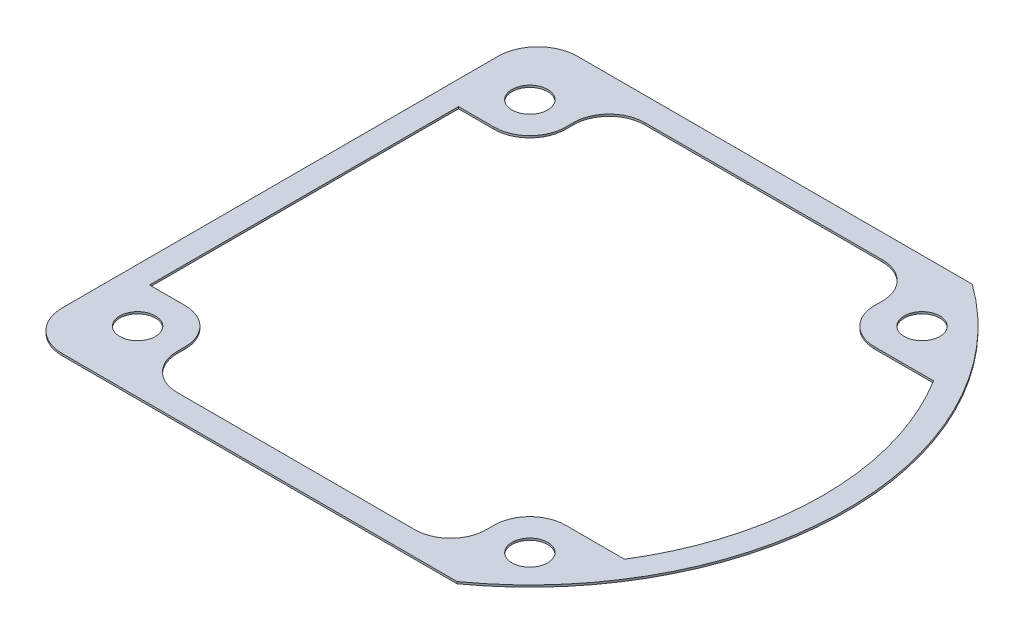
ISO-10303-21;
HEADER;
FILE_DESCRIPTION(('STEP AP214'),'2;1');
FILE_NAME('part.step','',(''),(''),'','','');
FILE_SCHEMA(('AUTOMOTIVE_DESIGN { 1 0 10303 214 1 1 1 1 }'));
ENDSEC;
DATA;
#1=APPLICATION_CONTEXT('core data for automotive mechanical design processes');
#2=APPLICATION_PROTOCOL_DEFINITION('international standard','automotive_design',2000,#1);
#3=PRODUCT_CONTEXT('',#1,'mechanical');
#4=PRODUCT('Part','Part','',(#3));
#5=PRODUCT_RELATED_PRODUCT_CATEGORY('part','',(#4));
#6=PRODUCT_DEFINITION_FORMATION('','',#4);
#7=PRODUCT_DEFINITION_CONTEXT('part definition',#1,'design');
#8=PRODUCT_DEFINITION('design','',#6,#7);
#9=PRODUCT_DEFINITION_SHAPE('','',#8);
#10=(LENGTH_UNIT() NAMED_UNIT(*) SI_UNIT(.MILLI.,.METRE.));
#11=(NAMED_UNIT(*) PLANE_ANGLE_UNIT() SI_UNIT($,.RADIAN.));
#12=(NAMED_UNIT(*) SI_UNIT($,.STERADIAN.) SOLID_ANGLE_UNIT());
#13=UNCERTAINTY_MEASURE_WITH_UNIT(LENGTH_MEASURE(1.E-05),#10,'distance_accuracy_value','');
#14=(GEOMETRIC_REPRESENTATION_CONTEXT(3) GLOBAL_UNCERTAINTY_ASSIGNED_CONTEXT((#13)) GLOBAL_UNIT_ASSIGNED_CONTEXT((#10,
#11,#12)) REPRESENTATION_CONTEXT('',''));
#15=CARTESIAN_POINT('',(0.,0.,0.));
#16=DIRECTION('',(0.,0.,1.));
#17=DIRECTION('',(1.,0.,0.));
#18=AXIS2_PLACEMENT_3D('',#15,#16,#17);
#19=CARTESIAN_POINT('',(-63.,0.5,-65.));
#20=DIRECTION('',(1.,0.,0.));
#21=DIRECTION('',(0.,0.,-1.));
#22=AXIS2_PLACEMENT_3D('',#19,#20,#21);
#23=PLANE('',#22);
#24=DIRECTION('',(0.,0.,1.));
#25=VECTOR('',#24,1.);
#26=CARTESIAN_POINT('',(-63.,0.5,-65.));
#27=LINE('',#26,#25);
#28=CARTESIAN_POINT('',(-63.,0.5,-55.));
#29=VERTEX_POINT('',#28);
#30=CARTESIAN_POINT('',(-63.,0.5,55.));
#31=VERTEX_POINT('',#30);
#32=EDGE_CURVE('E397',#29,#31,#27,.T.);
#33=ORIENTED_EDGE('',*,*,#32,.F.);
#34=DIRECTION('',(0.,-1.,0.));
#35=VECTOR('',#34,1.);
#36=CARTESIAN_POINT('',(-63.,0.5,-55.));
#37=LINE('',#36,#35);
#38=CARTESIAN_POINT('',(-63.,0.,-55.));
#39=VERTEX_POINT('',#38);
#40=EDGE_CURVE('E424',#29,#39,#37,.T.);
#41=ORIENTED_EDGE('',*,*,#40,.T.);
#42=DIRECTION('',(0.,0.,1.));
#43=VECTOR('',#42,1.);
#44=CARTESIAN_POINT('',(-63.,0.,-65.));
#45=LINE('',#44,#43);
#46=CARTESIAN_POINT('',(-63.,0.,55.));
#47=VERTEX_POINT('',#46);
#48=EDGE_CURVE('E394',#39,#47,#45,.T.);
#49=ORIENTED_EDGE('',*,*,#48,.T.);
#50=DIRECTION('',(0.,-1.,0.));
#51=VECTOR('',#50,1.);
#52=CARTESIAN_POINT('',(-63.,0.5,55.));
#53=LINE('',#52,#51);
#54=EDGE_CURVE('E422',#47,#31,#53,.F.);
#55=ORIENTED_EDGE('',*,*,#54,.T.);
#56=EDGE_LOOP('',(#33,#41,#49,#55));
#57=FACE_BOUND('',#56,.T.);
#58=ADVANCED_FACE('F35',(#57),#23,.F.);
#59=CARTESIAN_POINT('',(-63.,0.5,65.));
#60=DIRECTION('',(0.,0.,-1.));
#61=DIRECTION('',(-1.,0.,0.));
#62=AXIS2_PLACEMENT_3D('',#59,#60,#61);
#63=PLANE('',#62);
#64=DIRECTION('',(1.,0.,0.));
#65=VECTOR('',#64,1.);
#66=CARTESIAN_POINT('',(-63.,0.5,65.));
#67=LINE('',#66,#65);
#68=CARTESIAN_POINT('',(-53.,0.5,65.));
#69=VERTEX_POINT('',#68);
#70=CARTESIAN_POINT('',(46.6368952654441,0.5,65.));
#71=VERTEX_POINT('',#70);
#72=EDGE_CURVE('E400',#69,#71,#67,.T.);
#73=ORIENTED_EDGE('',*,*,#72,.F.);
#74=DIRECTION('',(0.,-1.,0.));
#75=VECTOR('',#74,1.);
#76=CARTESIAN_POINT('',(-53.,0.5,65.));
#77=LINE('',#76,#75);
#78=CARTESIAN_POINT('',(-53.,0.,65.));
#79=VERTEX_POINT('',#78);
#80=EDGE_CURVE('E11',#69,#79,#77,.T.);
#81=ORIENTED_EDGE('',*,*,#80,.T.);
#82=DIRECTION('',(1.,0.,0.));
#83=VECTOR('',#82,1.);
#84=CARTESIAN_POINT('',(-63.,0.,65.));
#85=LINE('',#84,#83);
#86=CARTESIAN_POINT('',(46.6368952654441,0.,65.));
#87=VERTEX_POINT('',#86);
#88=EDGE_CURVE('E411',#79,#87,#85,.T.);
#89=ORIENTED_EDGE('',*,*,#88,.T.);
#90=DIRECTION('',(0.,-1.,0.));
#91=VECTOR('',#90,1.);
#92=CARTESIAN_POINT('',(46.6368952654441,0.5,65.));
#93=LINE('',#92,#91);
#94=EDGE_CURVE('E419',#71,#87,#93,.T.);
#95=ORIENTED_EDGE('',*,*,#94,.F.);
#96=EDGE_LOOP('',(#73,#81,#89,#95));
#97=FACE_BOUND('',#96,.T.);
#98=ADVANCED_FACE('F460',(#97),#63,.F.);
#99=CARTESIAN_POINT('',(0.,0.5,0.));
#100=DIRECTION('',(0.,-1.,0.));
#101=DIRECTION('',(0.,0.,-1.));
#102=AXIS2_PLACEMENT_3D('',#99,#100,#101);
#103=CYLINDRICAL_SURFACE('',#102,80.);
#104=CARTESIAN_POINT('',(0.,0.,0.));
#105=DIRECTION('',(0.,1.,0.));
#106=DIRECTION('',(0.,0.,1.));
#107=AXIS2_PLACEMENT_3D('',#104,#105,#106);
#108=CIRCLE('',#107,80.);
#109=CARTESIAN_POINT('',(46.6368952654441,0.,-65.));
#110=VERTEX_POINT('',#109);
#111=EDGE_CURVE('E413',#87,#110,#108,.T.);
#112=ORIENTED_EDGE('',*,*,#111,.T.);
#113=DIRECTION('',(0.,-1.,0.));
#114=VECTOR('',#113,1.);
#115=CARTESIAN_POINT('',(46.6368952654441,0.5,-65.));
#116=LINE('',#115,#114);
#117=CARTESIAN_POINT('',(46.6368952654441,0.5,-65.));
#118=VERTEX_POINT('',#117);
#119=EDGE_CURVE('E408',#118,#110,#116,.T.);
#120=ORIENTED_EDGE('',*,*,#119,.F.);
#121=CARTESIAN_POINT('',(0.,0.5,0.));
#122=DIRECTION('',(0.,1.,0.));
#123=DIRECTION('',(0.,0.,1.));
#124=AXIS2_PLACEMENT_3D('',#121,#122,#123);
#125=CIRCLE('',#124,80.);
#126=EDGE_CURVE('E403',#71,#118,#125,.T.);
#127=ORIENTED_EDGE('',*,*,#126,.F.);
#128=ORIENTED_EDGE('',*,*,#94,.T.);
#129=EDGE_LOOP('',(#112,#120,#127,#128));
#130=FACE_BOUND('',#129,.T.);
#131=ADVANCED_FACE('F455',(#130),#103,.T.);
#132=CARTESIAN_POINT('',(-63.,0.5,-65.));
#133=DIRECTION('',(0.,0.,1.));
#134=DIRECTION('',(1.,0.,0.));
#135=AXIS2_PLACEMENT_3D('',#132,#133,#134);
#136=PLANE('',#135);
#137=DIRECTION('',(-1.,0.,0.));
#138=VECTOR('',#137,1.);
#139=CARTESIAN_POINT('',(-63.,0.,-65.));
#140=LINE('',#139,#138);
#141=CARTESIAN_POINT('',(-53.,0.,-65.));
#142=VERTEX_POINT('',#141);
#143=EDGE_CURVE('E401',#110,#142,#140,.T.);
#144=ORIENTED_EDGE('',*,*,#143,.T.);
#145=DIRECTION('',(0.,-1.,0.));
#146=VECTOR('',#145,1.);
#147=CARTESIAN_POINT('',(-53.,0.5,-65.));
#148=LINE('',#147,#146);
#149=CARTESIAN_POINT('',(-53.,0.5,-65.));
#150=VERTEX_POINT('',#149);
#151=EDGE_CURVE('E431',#142,#150,#148,.F.);
#152=ORIENTED_EDGE('',*,*,#151,.T.);
#153=DIRECTION('',(-1.,0.,0.));
#154=VECTOR('',#153,1.);
#155=CARTESIAN_POINT('',(-63.,0.5,-65.));
#156=LINE('',#155,#154);
#157=EDGE_CURVE('E405',#118,#150,#156,.T.);
#158=ORIENTED_EDGE('',*,*,#157,.F.);
#159=ORIENTED_EDGE('',*,*,#119,.T.);
#160=EDGE_LOOP('',(#144,#152,#158,#159));
#161=FACE_BOUND('',#160,.T.);
#162=ADVANCED_FACE('F451',(#161),#136,.F.);
#163=CARTESIAN_POINT('',(0.,0.5,0.));
#164=DIRECTION('',(0.,1.,0.));
#165=DIRECTION('',(0.,0.,1.));
#166=AXIS2_PLACEMENT_3D('',#163,#164,#165);
#167=PLANE('',#166);
#168=CARTESIAN_POINT('',(47.9974746830591,0.5,-47.9974746830576));
#169=DIRECTION('',(0.,-1.,0.));
#170=DIRECTION('',(0.,0.,-1.));
#171=AXIS2_PLACEMENT_3D('',#168,#169,#170);
#172=CIRCLE('',#171,8.99999999999999);
#173=CARTESIAN_POINT('',(47.9974746830592,0.5,-38.9974746830576));
#174=VERTEX_POINT('',#173);
#175=CARTESIAN_POINT('',(38.9974746830591,0.5,-47.9974746830576));
#176=VERTEX_POINT('',#175);
#177=EDGE_CURVE('E50',#174,#176,#172,.T.);
#178=ORIENTED_EDGE('',*,*,#177,.F.);
#179=DIRECTION('',(-1.,0.,0.));
#180=VECTOR('',#179,1.);
#181=CARTESIAN_POINT('',(47.9974746830592,0.5,-38.9974746830576));
#182=LINE('',#181,#180);
#183=CARTESIAN_POINT('',(62.8903567198047,0.5,-38.9974746830576));
#184=VERTEX_POINT('',#183);
#185=EDGE_CURVE('E227',#184,#174,#182,.T.);
#186=ORIENTED_EDGE('',*,*,#185,.F.);
#187=CARTESIAN_POINT('',(0.,0.5,0.));
#188=DIRECTION('',(0.,1.,0.));
#189=DIRECTION('',(0.,0.,1.));
#190=AXIS2_PLACEMENT_3D('',#187,#188,#189);
#191=CIRCLE('',#190,74.);
#192=CARTESIAN_POINT('',(62.8903567198047,0.5,38.9974746830576));
#193=VERTEX_POINT('',#192);
#194=EDGE_CURVE('E230',#193,#184,#191,.T.);
#195=ORIENTED_EDGE('',*,*,#194,.F.);
#196=DIRECTION('',(1.,0.,0.));
#197=VECTOR('',#196,1.);
#198=CARTESIAN_POINT('',(47.9974746830592,0.5,38.9974746830576));
#199=LINE('',#198,#197);
#200=CARTESIAN_POINT('',(47.9974746830592,0.5,38.9974746830576));
#201=VERTEX_POINT('',#200);
#202=EDGE_CURVE('E330',#201,#193,#199,.T.);
#203=ORIENTED_EDGE('',*,*,#202,.F.);
#204=CARTESIAN_POINT('',(47.9974746830591,0.5,47.9974746830576));
#205=DIRECTION('',(0.,-1.,0.));
#206=DIRECTION('',(0.,0.,1.));
#207=AXIS2_PLACEMENT_3D('',#204,#205,#206);
#208=CIRCLE('',#207,8.99999999999999);
#209=CARTESIAN_POINT('',(38.9974746830591,0.5,47.9974746830576));
#210=VERTEX_POINT('',#209);
#211=EDGE_CURVE('E327',#210,#201,#208,.T.);
#212=ORIENTED_EDGE('',*,*,#211,.F.);
#213=DIRECTION('',(0.,0.,-1.));
#214=VECTOR('',#213,1.);
#215=CARTESIAN_POINT('',(38.9974746830591,0.5,47.9974746830576));
#216=LINE('',#215,#214);
#217=CARTESIAN_POINT('',(38.9974746830591,0.5,49.9999999999999));
#218=VERTEX_POINT('',#217);
#219=EDGE_CURVE('E324',#218,#210,#216,.T.);
#220=ORIENTED_EDGE('',*,*,#219,.F.);
#221=CARTESIAN_POINT('',(29.9974746830591,0.5,50.));
#222=DIRECTION('',(0.,1.,0.));
#223=DIRECTION('',(0.,0.,-1.));
#224=AXIS2_PLACEMENT_3D('',#221,#222,#223);
#225=CIRCLE('',#224,9.);
#226=CARTESIAN_POINT('',(29.9974746830591,0.5,59.));
#227=VERTEX_POINT('',#226);
#228=EDGE_CURVE('E321',#227,#218,#225,.T.);
#229=ORIENTED_EDGE('',*,*,#228,.F.);
#230=DIRECTION('',(1.,0.,0.));
#231=VECTOR('',#230,1.);
#232=CARTESIAN_POINT('',(-29.9974746830591,0.5,59.));
#233=LINE('',#232,#231);
#234=CARTESIAN_POINT('',(-29.9974746830591,0.5,59.));
#235=VERTEX_POINT('',#234);
#236=EDGE_CURVE('E318',#235,#227,#233,.T.);
#237=ORIENTED_EDGE('',*,*,#236,.F.);
#238=CARTESIAN_POINT('',(-29.9974746830591,0.5,50.));
#239=DIRECTION('',(0.,1.,0.));
#240=DIRECTION('',(0.,0.,1.));
#241=AXIS2_PLACEMENT_3D('',#238,#239,#240);
#242=CIRCLE('',#241,9.);
#243=CARTESIAN_POINT('',(-38.9974746830591,0.5,49.9999999999999));
#244=VERTEX_POINT('',#243);
#245=EDGE_CURVE('E315',#244,#235,#242,.T.);
#246=ORIENTED_EDGE('',*,*,#245,.F.);
#247=DIRECTION('',(0.,0.,1.));
#248=VECTOR('',#247,1.);
#249=CARTESIAN_POINT('',(-38.9974746830591,0.5,47.9974746830576));
#250=LINE('',#249,#248);
#251=CARTESIAN_POINT('',(-38.9974746830591,0.5,47.9974746830576));
#252=VERTEX_POINT('',#251);
#253=EDGE_CURVE('E312',#252,#244,#250,.T.);
#254=ORIENTED_EDGE('',*,*,#253,.F.);
#255=CARTESIAN_POINT('',(-47.9974746830591,0.5,47.9974746830576));
#256=DIRECTION('',(0.,-1.,0.));
#257=DIRECTION('',(0.,0.,-1.));
#258=AXIS2_PLACEMENT_3D('',#255,#256,#257);
#259=CIRCLE('',#258,8.99999999999999);
#260=CARTESIAN_POINT('',(-47.9974746830592,0.5,38.9974746830576));
#261=VERTEX_POINT('',#260);
#262=EDGE_CURVE('E309',#261,#252,#259,.T.);
#263=ORIENTED_EDGE('',*,*,#262,.F.);
#264=DIRECTION('',(1.,0.,0.));
#265=VECTOR('',#264,1.);
#266=CARTESIAN_POINT('',(-47.9974746830592,0.5,38.9974746830576));
#267=LINE('',#266,#265);
#268=CARTESIAN_POINT('',(-57.,0.5,38.9974746830576));
#269=VERTEX_POINT('',#268);
#270=EDGE_CURVE('E306',#269,#261,#267,.T.);
#271=ORIENTED_EDGE('',*,*,#270,.F.);
#272=DIRECTION('',(0.,0.,1.));
#273=VECTOR('',#272,1.);
#274=CARTESIAN_POINT('',(-57.,0.5,-38.9974746830576));
#275=LINE('',#274,#273);
#276=CARTESIAN_POINT('',(-57.,0.5,-38.9974746830576));
#277=VERTEX_POINT('',#276);
#278=EDGE_CURVE('E303',#277,#269,#275,.T.);
#279=ORIENTED_EDGE('',*,*,#278,.F.);
#280=DIRECTION('',(-1.,0.,0.));
#281=VECTOR('',#280,1.);
#282=CARTESIAN_POINT('',(-47.9974746830592,0.5,-38.9974746830576));
#283=LINE('',#282,#281);
#284=CARTESIAN_POINT('',(-47.9974746830592,0.5,-38.9974746830576));
#285=VERTEX_POINT('',#284);
#286=EDGE_CURVE('E300',#285,#277,#283,.T.);
#287=ORIENTED_EDGE('',*,*,#286,.F.);
#288=CARTESIAN_POINT('',(-47.9974746830591,0.5,-47.9974746830576));
#289=DIRECTION('',(0.,-1.,0.));
#290=DIRECTION('',(0.,0.,1.));
#291=AXIS2_PLACEMENT_3D('',#288,#289,#290);
#292=CIRCLE('',#291,8.99999999999999);
#293=CARTESIAN_POINT('',(-38.9974746830591,0.5,-47.9974746830576));
#294=VERTEX_POINT('',#293);
#295=EDGE_CURVE('E297',#294,#285,#292,.T.);
#296=ORIENTED_EDGE('',*,*,#295,.F.);
#297=DIRECTION('',(0.,0.,1.));
#298=VECTOR('',#297,1.);
#299=CARTESIAN_POINT('',(-38.9974746830591,0.5,-47.9974746830576));
#300=LINE('',#299,#298);
#301=CARTESIAN_POINT('',(-38.9974746830591,0.5,-49.9999999999999));
#302=VERTEX_POINT('',#301);
#303=EDGE_CURVE('E294',#302,#294,#300,.T.);
#304=ORIENTED_EDGE('',*,*,#303,.F.);
#305=CARTESIAN_POINT('',(-29.9974746830591,0.5,-50.));
#306=DIRECTION('',(0.,1.,0.));
#307=DIRECTION('',(0.,0.,-1.));
#308=AXIS2_PLACEMENT_3D('',#305,#306,#307);
#309=CIRCLE('',#308,9.);
#310=CARTESIAN_POINT('',(-29.9974746830591,0.5,-59.));
#311=VERTEX_POINT('',#310);
#312=EDGE_CURVE('E291',#311,#302,#309,.T.);
#313=ORIENTED_EDGE('',*,*,#312,.F.);
#314=DIRECTION('',(-1.,0.,0.));
#315=VECTOR('',#314,1.);
#316=CARTESIAN_POINT('',(29.9974746830591,0.5,-59.));
#317=LINE('',#316,#315);
#318=CARTESIAN_POINT('',(29.9974746830591,0.5,-59.));
#319=VERTEX_POINT('',#318);
#320=EDGE_CURVE('E288',#319,#311,#317,.T.);
#321=ORIENTED_EDGE('',*,*,#320,.F.);
#322=CARTESIAN_POINT('',(29.9974746830591,0.5,-50.));
#323=DIRECTION('',(0.,1.,0.));
#324=DIRECTION('',(0.,0.,1.));
#325=AXIS2_PLACEMENT_3D('',#322,#323,#324);
#326=CIRCLE('',#325,9.);
#327=CARTESIAN_POINT('',(38.9974746830591,0.5,-49.9999999999999));
#328=VERTEX_POINT('',#327);
#329=EDGE_CURVE('E285',#328,#319,#326,.T.);
#330=ORIENTED_EDGE('',*,*,#329,.F.);
#331=DIRECTION('',(0.,0.,-1.));
#332=VECTOR('',#331,1.);
#333=CARTESIAN_POINT('',(38.9974746830591,0.5,-47.9974746830576));
#334=LINE('',#333,#332);
#335=EDGE_CURVE('E283',#176,#328,#334,.T.);
#336=ORIENTED_EDGE('',*,*,#335,.F.);
#337=EDGE_LOOP('',(#178,#186,#195,#203,#212,#220,#229,#237,#246,#254,#263,#271,#279,#287,#296,
#304,#313,#321,#330,#336));
#338=FACE_BOUND('',#337,.T.);
#339=CARTESIAN_POINT('',(-49.4974746830577,0.5,-49.4974746830589));
#340=DIRECTION('',(0.,1.,0.));
#341=DIRECTION('',(0.,0.,1.));
#342=AXIS2_PLACEMENT_3D('',#339,#340,#341);
#343=CIRCLE('',#342,4.5);
#344=CARTESIAN_POINT('',(-49.4974746830577,0.5,-44.9974746830589));
#345=VERTEX_POINT('',#344);
#346=EDGE_CURVE('E337',#345,#345,#343,.T.);
#347=ORIENTED_EDGE('',*,*,#346,.F.);
#348=EDGE_LOOP('',(#347));
#349=FACE_BOUND('',#348,.T.);
#350=CARTESIAN_POINT('',(49.4974746830591,0.5,-49.4974746830576));
#351=DIRECTION('',(0.,1.,0.));
#352=DIRECTION('',(0.,0.,1.));
#353=AXIS2_PLACEMENT_3D('',#350,#351,#352);
#354=CIRCLE('',#353,4.5);
#355=CARTESIAN_POINT('',(49.4974746830591,0.5,-44.9974746830576));
#356=VERTEX_POINT('',#355);
#357=EDGE_CURVE('E383',#356,#356,#354,.T.);
#358=ORIENTED_EDGE('',*,*,#357,.F.);
#359=EDGE_LOOP('',(#358));
#360=FACE_BOUND('',#359,.T.);
#361=CARTESIAN_POINT('',(49.4974746830581,0.5,49.4974746830586));
#362=DIRECTION('',(0.,1.,0.));
#363=DIRECTION('',(0.,0.,1.));
#364=AXIS2_PLACEMENT_3D('',#361,#362,#363);
#365=CIRCLE('',#364,4.5);
#366=CARTESIAN_POINT('',(49.4974746830581,0.5,53.9974746830586));
#367=VERTEX_POINT('',#366);
#368=EDGE_CURVE('E377',#367,#367,#365,.T.);
#369=ORIENTED_EDGE('',*,*,#368,.F.);
#370=EDGE_LOOP('',(#369));
#371=FACE_BOUND('',#370,.T.);
#372=CARTESIAN_POINT('',(-49.4974746830588,0.5,49.4974746830579));
#373=DIRECTION('',(0.,1.,0.));
#374=DIRECTION('',(0.,0.,1.));
#375=AXIS2_PLACEMENT_3D('',#372,#373,#374);
#376=CIRCLE('',#375,4.5);
#377=CARTESIAN_POINT('',(-49.4974746830588,0.5,53.9974746830579));
#378=VERTEX_POINT('',#377);
#379=EDGE_CURVE('E376',#378,#378,#376,.T.);
#380=ORIENTED_EDGE('',*,*,#379,.F.);
#381=EDGE_LOOP('',(#380));
#382=FACE_BOUND('',#381,.T.);
#383=ORIENTED_EDGE('',*,*,#157,.T.);
#384=CARTESIAN_POINT('',(-53.,0.5,-55.));
#385=DIRECTION('',(0.,1.,0.));
#386=DIRECTION('',(0.,0.,1.));
#387=AXIS2_PLACEMENT_3D('',#384,#385,#386);
#388=CIRCLE('',#387,10.);
#389=EDGE_CURVE('E43',#150,#29,#388,.T.);
#390=ORIENTED_EDGE('',*,*,#389,.T.);
#391=ORIENTED_EDGE('',*,*,#32,.T.);
#392=CARTESIAN_POINT('',(-53.,0.5,55.));
#393=DIRECTION('',(0.,1.,0.));
#394=DIRECTION('',(0.,0.,1.));
#395=AXIS2_PLACEMENT_3D('',#392,#393,#394);
#396=CIRCLE('',#395,10.);
#397=EDGE_CURVE('E433',#31,#69,#396,.T.);
#398=ORIENTED_EDGE('',*,*,#397,.T.);
#399=ORIENTED_EDGE('',*,*,#72,.T.);
#400=ORIENTED_EDGE('',*,*,#126,.T.);
#401=EDGE_LOOP('',(#383,#390,#391,#398,#399,#400));
#402=FACE_BOUND('',#401,.T.);
#403=ADVANCED_FACE('F437',(#338,#349,#360,#371,#382,#402),#167,.T.);
#404=CARTESIAN_POINT('',(0.,0.,0.));
#405=DIRECTION('',(0.,1.,0.));
#406=DIRECTION('',(0.,0.,1.));
#407=AXIS2_PLACEMENT_3D('',#404,#405,#406);
#408=PLANE('',#407);
#409=DIRECTION('',(-1.,0.,0.));
#410=VECTOR('',#409,1.);
#411=CARTESIAN_POINT('',(47.9974746830592,0.,-38.9974746830576));
#412=LINE('',#411,#410);
#413=CARTESIAN_POINT('',(62.8903567198047,0.,-38.9974746830576));
#414=VERTEX_POINT('',#413);
#415=CARTESIAN_POINT('',(47.9974746830592,0.,-38.9974746830576));
#416=VERTEX_POINT('',#415);
#417=EDGE_CURVE('E216',#414,#416,#412,.T.);
#418=ORIENTED_EDGE('',*,*,#417,.T.);
#419=CARTESIAN_POINT('',(47.9974746830591,0.,-47.9974746830576));
#420=DIRECTION('',(0.,-1.,0.));
#421=DIRECTION('',(0.,0.,-1.));
#422=AXIS2_PLACEMENT_3D('',#419,#420,#421);
#423=CIRCLE('',#422,8.99999999999999);
#424=CARTESIAN_POINT('',(38.9974746830591,0.,-47.9974746830576));
#425=VERTEX_POINT('',#424);
#426=EDGE_CURVE('E210',#416,#425,#423,.T.);
#427=ORIENTED_EDGE('',*,*,#426,.T.);
#428=DIRECTION('',(0.,0.,-1.));
#429=VECTOR('',#428,1.);
#430=CARTESIAN_POINT('',(38.9974746830591,0.,-47.9974746830576));
#431=LINE('',#430,#429);
#432=CARTESIAN_POINT('',(38.9974746830591,0.,-49.9999999999999));
#433=VERTEX_POINT('',#432);
#434=EDGE_CURVE('E219',#425,#433,#431,.T.);
#435=ORIENTED_EDGE('',*,*,#434,.T.);
#436=CARTESIAN_POINT('',(29.9974746830591,0.,-50.));
#437=DIRECTION('',(0.,1.,0.));
#438=DIRECTION('',(0.,0.,1.));
#439=AXIS2_PLACEMENT_3D('',#436,#437,#438);
#440=CIRCLE('',#439,9.);
#441=CARTESIAN_POINT('',(29.9974746830591,0.,-59.));
#442=VERTEX_POINT('',#441);
#443=EDGE_CURVE('E58',#433,#442,#440,.T.);
#444=ORIENTED_EDGE('',*,*,#443,.T.);
#445=DIRECTION('',(-1.,0.,0.));
#446=VECTOR('',#445,1.);
#447=CARTESIAN_POINT('',(29.9974746830591,0.,-59.));
#448=LINE('',#447,#446);
#449=CARTESIAN_POINT('',(-29.9974746830591,0.,-59.));
#450=VERTEX_POINT('',#449);
#451=EDGE_CURVE('E234',#442,#450,#448,.T.);
#452=ORIENTED_EDGE('',*,*,#451,.T.);
#453=CARTESIAN_POINT('',(-29.9974746830591,0.,-50.));
#454=DIRECTION('',(0.,1.,0.));
#455=DIRECTION('',(0.,0.,-1.));
#456=AXIS2_PLACEMENT_3D('',#453,#454,#455);
#457=CIRCLE('',#456,9.);
#458=CARTESIAN_POINT('',(-38.9974746830591,0.,-49.9999999999999));
#459=VERTEX_POINT('',#458);
#460=EDGE_CURVE('E237',#450,#459,#457,.T.);
#461=ORIENTED_EDGE('',*,*,#460,.T.);
#462=DIRECTION('',(0.,0.,1.));
#463=VECTOR('',#462,1.);
#464=CARTESIAN_POINT('',(-38.9974746830591,0.,-47.9974746830576));
#465=LINE('',#464,#463);
#466=CARTESIAN_POINT('',(-38.9974746830591,0.,-47.9974746830576));
#467=VERTEX_POINT('',#466);
#468=EDGE_CURVE('E240',#459,#467,#465,.T.);
#469=ORIENTED_EDGE('',*,*,#468,.T.);
#470=CARTESIAN_POINT('',(-47.9974746830591,0.,-47.9974746830576));
#471=DIRECTION('',(0.,-1.,0.));
#472=DIRECTION('',(0.,0.,1.));
#473=AXIS2_PLACEMENT_3D('',#470,#471,#472);
#474=CIRCLE('',#473,8.99999999999999);
#475=CARTESIAN_POINT('',(-47.9974746830592,0.,-38.9974746830576));
#476=VERTEX_POINT('',#475);
#477=EDGE_CURVE('E243',#467,#476,#474,.T.);
#478=ORIENTED_EDGE('',*,*,#477,.T.);
#479=DIRECTION('',(-1.,0.,0.));
#480=VECTOR('',#479,1.);
#481=CARTESIAN_POINT('',(-47.9974746830592,0.,-38.9974746830576));
#482=LINE('',#481,#480);
#483=CARTESIAN_POINT('',(-57.,0.,-38.9974746830576));
#484=VERTEX_POINT('',#483);
#485=EDGE_CURVE('E246',#476,#484,#482,.T.);
#486=ORIENTED_EDGE('',*,*,#485,.T.);
#487=DIRECTION('',(0.,0.,1.));
#488=VECTOR('',#487,1.);
#489=CARTESIAN_POINT('',(-57.,0.,-38.9974746830576));
#490=LINE('',#489,#488);
#491=CARTESIAN_POINT('',(-57.,0.,38.9974746830576));
#492=VERTEX_POINT('',#491);
#493=EDGE_CURVE('E249',#484,#492,#490,.T.);
#494=ORIENTED_EDGE('',*,*,#493,.T.);
#495=DIRECTION('',(1.,0.,0.));
#496=VECTOR('',#495,1.);
#497=CARTESIAN_POINT('',(-47.9974746830592,0.,38.9974746830576));
#498=LINE('',#497,#496);
#499=CARTESIAN_POINT('',(-47.9974746830592,0.,38.9974746830576));
#500=VERTEX_POINT('',#499);
#501=EDGE_CURVE('E252',#492,#500,#498,.T.);
#502=ORIENTED_EDGE('',*,*,#501,.T.);
#503=CARTESIAN_POINT('',(-47.9974746830591,0.,47.9974746830576));
#504=DIRECTION('',(0.,-1.,0.));
#505=DIRECTION('',(0.,0.,-1.));
#506=AXIS2_PLACEMENT_3D('',#503,#504,#505);
#507=CIRCLE('',#506,8.99999999999999);
#508=CARTESIAN_POINT('',(-38.9974746830591,0.,47.9974746830576));
#509=VERTEX_POINT('',#508);
#510=EDGE_CURVE('E255',#500,#509,#507,.T.);
#511=ORIENTED_EDGE('',*,*,#510,.T.);
#512=DIRECTION('',(0.,0.,1.));
#513=VECTOR('',#512,1.);
#514=CARTESIAN_POINT('',(-38.9974746830591,0.,47.9974746830576));
#515=LINE('',#514,#513);
#516=CARTESIAN_POINT('',(-38.9974746830591,0.,49.9999999999999));
#517=VERTEX_POINT('',#516);
#518=EDGE_CURVE('E258',#509,#517,#515,.T.);
#519=ORIENTED_EDGE('',*,*,#518,.T.);
#520=CARTESIAN_POINT('',(-29.9974746830591,0.,50.));
#521=DIRECTION('',(0.,1.,0.));
#522=DIRECTION('',(0.,0.,1.));
#523=AXIS2_PLACEMENT_3D('',#520,#521,#522);
#524=CIRCLE('',#523,9.);
#525=CARTESIAN_POINT('',(-29.9974746830591,0.,59.));
#526=VERTEX_POINT('',#525);
#527=EDGE_CURVE('E261',#517,#526,#524,.T.);
#528=ORIENTED_EDGE('',*,*,#527,.T.);
#529=DIRECTION('',(1.,0.,0.));
#530=VECTOR('',#529,1.);
#531=CARTESIAN_POINT('',(-29.9974746830591,0.,59.));
#532=LINE('',#531,#530);
#533=CARTESIAN_POINT('',(29.9974746830591,0.,59.));
#534=VERTEX_POINT('',#533);
#535=EDGE_CURVE('E264',#526,#534,#532,.T.);
#536=ORIENTED_EDGE('',*,*,#535,.T.);
#537=CARTESIAN_POINT('',(29.9974746830591,0.,50.));
#538=DIRECTION('',(0.,1.,0.));
#539=DIRECTION('',(0.,0.,-1.));
#540=AXIS2_PLACEMENT_3D('',#537,#538,#539);
#541=CIRCLE('',#540,9.);
#542=CARTESIAN_POINT('',(38.9974746830591,0.,49.9999999999999));
#543=VERTEX_POINT('',#542);
#544=EDGE_CURVE('E267',#534,#543,#541,.T.);
#545=ORIENTED_EDGE('',*,*,#544,.T.);
#546=DIRECTION('',(0.,0.,-1.));
#547=VECTOR('',#546,1.);
#548=CARTESIAN_POINT('',(38.9974746830591,0.,47.9974746830576));
#549=LINE('',#548,#547);
#550=CARTESIAN_POINT('',(38.9974746830591,0.,47.9974746830576));
#551=VERTEX_POINT('',#550);
#552=EDGE_CURVE('E270',#543,#551,#549,.T.);
#553=ORIENTED_EDGE('',*,*,#552,.T.);
#554=CARTESIAN_POINT('',(47.9974746830591,0.,47.9974746830576));
#555=DIRECTION('',(0.,-1.,0.));
#556=DIRECTION('',(0.,0.,1.));
#557=AXIS2_PLACEMENT_3D('',#554,#555,#556);
#558=CIRCLE('',#557,8.99999999999999);
#559=CARTESIAN_POINT('',(47.9974746830592,0.,38.9974746830576));
#560=VERTEX_POINT('',#559);
#561=EDGE_CURVE('E273',#551,#560,#558,.T.);
#562=ORIENTED_EDGE('',*,*,#561,.T.);
#563=DIRECTION('',(1.,0.,0.));
#564=VECTOR('',#563,1.);
#565=CARTESIAN_POINT('',(47.9974746830592,0.,38.9974746830576));
#566=LINE('',#565,#564);
#567=CARTESIAN_POINT('',(62.8903567198047,0.,38.9974746830576));
#568=VERTEX_POINT('',#567);
#569=EDGE_CURVE('E276',#560,#568,#566,.T.);
#570=ORIENTED_EDGE('',*,*,#569,.T.);
#571=CARTESIAN_POINT('',(0.,0.,0.));
#572=DIRECTION('',(0.,1.,0.));
#573=DIRECTION('',(0.,0.,1.));
#574=AXIS2_PLACEMENT_3D('',#571,#572,#573);
#575=CIRCLE('',#574,74.);
#576=EDGE_CURVE('E279',#568,#414,#575,.T.);
#577=ORIENTED_EDGE('',*,*,#576,.T.);
#578=EDGE_LOOP('',(#418,#427,#435,#444,#452,#461,#469,#478,#486,#494,#502,#511,#519,#528,#536,
#545,#553,#562,#570,#577));
#579=FACE_BOUND('',#578,.T.);
#580=CARTESIAN_POINT('',(-49.4974746830577,0.,-49.4974746830589));
#581=DIRECTION('',(0.,1.,0.));
#582=DIRECTION('',(0.,0.,1.));
#583=AXIS2_PLACEMENT_3D('',#580,#581,#582);
#584=CIRCLE('',#583,4.5);
#585=CARTESIAN_POINT('',(-49.4974746830577,0.,-44.9974746830589));
#586=VERTEX_POINT('',#585);
#587=EDGE_CURVE('E386',#586,#586,#584,.T.);
#588=ORIENTED_EDGE('',*,*,#587,.T.);
#589=EDGE_LOOP('',(#588));
#590=FACE_BOUND('',#589,.T.);
#591=CARTESIAN_POINT('',(49.4974746830591,0.,-49.4974746830576));
#592=DIRECTION('',(0.,1.,0.));
#593=DIRECTION('',(0.,0.,1.));
#594=AXIS2_PLACEMENT_3D('',#591,#592,#593);
#595=CIRCLE('',#594,4.5);
#596=CARTESIAN_POINT('',(49.4974746830591,0.,-44.9974746830576));
#597=VERTEX_POINT('',#596);
#598=EDGE_CURVE('E380',#597,#597,#595,.T.);
#599=ORIENTED_EDGE('',*,*,#598,.T.);
#600=EDGE_LOOP('',(#599));
#601=FACE_BOUND('',#600,.T.);
#602=CARTESIAN_POINT('',(49.4974746830581,0.,49.4974746830586));
#603=DIRECTION('',(0.,1.,0.));
#604=DIRECTION('',(0.,0.,1.));
#605=AXIS2_PLACEMENT_3D('',#602,#603,#604);
#606=CIRCLE('',#605,4.5);
#607=CARTESIAN_POINT('',(49.4974746830581,0.,53.9974746830586));
#608=VERTEX_POINT('',#607);
#609=EDGE_CURVE('E373',#608,#608,#606,.T.);
#610=ORIENTED_EDGE('',*,*,#609,.T.);
#611=EDGE_LOOP('',(#610));
#612=FACE_BOUND('',#611,.T.);
#613=CARTESIAN_POINT('',(-49.4974746830588,0.,49.4974746830579));
#614=DIRECTION('',(0.,1.,0.));
#615=DIRECTION('',(0.,0.,1.));
#616=AXIS2_PLACEMENT_3D('',#613,#614,#615);
#617=CIRCLE('',#616,4.5);
#618=CARTESIAN_POINT('',(-49.4974746830588,0.,53.9974746830579));
#619=VERTEX_POINT('',#618);
#620=EDGE_CURVE('E391',#619,#619,#617,.T.);
#621=ORIENTED_EDGE('',*,*,#620,.T.);
#622=EDGE_LOOP('',(#621));
#623=FACE_BOUND('',#622,.T.);
#624=ORIENTED_EDGE('',*,*,#48,.F.);
#625=CARTESIAN_POINT('',(-53.,0.,-55.));
#626=DIRECTION('',(0.,1.,0.));
#627=DIRECTION('',(0.,0.,1.));
#628=AXIS2_PLACEMENT_3D('',#625,#626,#627);
#629=CIRCLE('',#628,10.);
#630=EDGE_CURVE('E429',#39,#142,#629,.F.);
#631=ORIENTED_EDGE('',*,*,#630,.T.);
#632=ORIENTED_EDGE('',*,*,#143,.F.);
#633=ORIENTED_EDGE('',*,*,#111,.F.);
#634=ORIENTED_EDGE('',*,*,#88,.F.);
#635=CARTESIAN_POINT('',(-53.,0.,55.));
#636=DIRECTION('',(0.,1.,0.));
#637=DIRECTION('',(0.,0.,1.));
#638=AXIS2_PLACEMENT_3D('',#635,#636,#637);
#639=CIRCLE('',#638,10.);
#640=EDGE_CURVE('E427',#79,#47,#639,.F.);
#641=ORIENTED_EDGE('',*,*,#640,.T.);
#642=EDGE_LOOP('',(#624,#631,#632,#633,#634,#641));
#643=FACE_BOUND('',#642,.T.);
#644=ADVANCED_FACE('F223',(#579,#590,#601,#612,#623,#643),#408,.F.);
#645=CARTESIAN_POINT('',(-53.,0.5,-55.));
#646=DIRECTION('',(0.,-1.,0.));
#647=DIRECTION('',(0.,0.,-1.));
#648=AXIS2_PLACEMENT_3D('',#645,#646,#647);
#649=CYLINDRICAL_SURFACE('',#648,10.);
#650=ORIENTED_EDGE('',*,*,#389,.F.);
#651=ORIENTED_EDGE('',*,*,#151,.F.);
#652=ORIENTED_EDGE('',*,*,#630,.F.);
#653=ORIENTED_EDGE('',*,*,#40,.F.);
#654=EDGE_LOOP('',(#650,#651,#652,#653));
#655=FACE_BOUND('',#654,.T.);
#656=ADVANCED_FACE('F446',(#655),#649,.T.);
#657=CARTESIAN_POINT('',(-53.,0.5,55.));
#658=DIRECTION('',(0.,-1.,0.));
#659=DIRECTION('',(0.,0.,-1.));
#660=AXIS2_PLACEMENT_3D('',#657,#658,#659);
#661=CYLINDRICAL_SURFACE('',#660,10.);
#662=ORIENTED_EDGE('',*,*,#397,.F.);
#663=ORIENTED_EDGE('',*,*,#54,.F.);
#664=ORIENTED_EDGE('',*,*,#640,.F.);
#665=ORIENTED_EDGE('',*,*,#80,.F.);
#666=EDGE_LOOP('',(#662,#663,#664,#665));
#667=FACE_BOUND('',#666,.T.);
#668=ADVANCED_FACE('F37',(#667),#661,.T.);
#669=CARTESIAN_POINT('',(-49.4974746830588,0.,49.4974746830579));
#670=DIRECTION('',(0.,1.,0.));
#671=DIRECTION('',(0.,0.,1.));
#672=AXIS2_PLACEMENT_3D('',#669,#670,#671);
#673=CYLINDRICAL_SURFACE('',#672,4.5);
#674=ORIENTED_EDGE('',*,*,#620,.F.);
#675=EDGE_LOOP('',(#674));
#676=FACE_BOUND('',#675,.T.);
#677=ORIENTED_EDGE('',*,*,#379,.T.);
#678=EDGE_LOOP('',(#677));
#679=FACE_BOUND('',#678,.T.);
#680=ADVANCED_FACE('F464',(#676,#679),#673,.F.);
#681=CARTESIAN_POINT('',(49.4974746830581,0.,49.4974746830586));
#682=DIRECTION('',(0.,1.,0.));
#683=DIRECTION('',(0.,0.,1.));
#684=AXIS2_PLACEMENT_3D('',#681,#682,#683);
#685=CYLINDRICAL_SURFACE('',#684,4.5);
#686=ORIENTED_EDGE('',*,*,#609,.F.);
#687=EDGE_LOOP('',(#686));
#688=FACE_BOUND('',#687,.T.);
#689=ORIENTED_EDGE('',*,*,#368,.T.);
#690=EDGE_LOOP('',(#689));
#691=FACE_BOUND('',#690,.T.);
#692=ADVANCED_FACE('F469',(#688,#691),#685,.F.);
#693=CARTESIAN_POINT('',(49.4974746830591,0.,-49.4974746830576));
#694=DIRECTION('',(0.,1.,0.));
#695=DIRECTION('',(0.,0.,1.));
#696=AXIS2_PLACEMENT_3D('',#693,#694,#695);
#697=CYLINDRICAL_SURFACE('',#696,4.5);
#698=ORIENTED_EDGE('',*,*,#598,.F.);
#699=EDGE_LOOP('',(#698));
#700=FACE_BOUND('',#699,.T.);
#701=ORIENTED_EDGE('',*,*,#357,.T.);
#702=EDGE_LOOP('',(#701));
#703=FACE_BOUND('',#702,.T.);
#704=ADVANCED_FACE('F491',(#700,#703),#697,.F.);
#705=CARTESIAN_POINT('',(-49.4974746830577,0.,-49.4974746830589));
#706=DIRECTION('',(0.,1.,0.));
#707=DIRECTION('',(0.,0.,1.));
#708=AXIS2_PLACEMENT_3D('',#705,#706,#707);
#709=CYLINDRICAL_SURFACE('',#708,4.5);
#710=ORIENTED_EDGE('',*,*,#587,.F.);
#711=EDGE_LOOP('',(#710));
#712=FACE_BOUND('',#711,.T.);
#713=ORIENTED_EDGE('',*,*,#346,.T.);
#714=EDGE_LOOP('',(#713));
#715=FACE_BOUND('',#714,.T.);
#716=ADVANCED_FACE('F488',(#712,#715),#709,.F.);
#717=CARTESIAN_POINT('',(47.9974746830591,0.,-47.9974746830576));
#718=DIRECTION('',(0.,1.,0.));
#719=DIRECTION('',(0.,0.,1.));
#720=AXIS2_PLACEMENT_3D('',#717,#718,#719);
#721=CYLINDRICAL_SURFACE('',#720,8.99999999999999);
#722=ORIENTED_EDGE('',*,*,#177,.T.);
#723=DIRECTION('',(0.,1.,0.));
#724=VECTOR('',#723,1.);
#725=CARTESIAN_POINT('',(38.9974746830591,0.,-47.9974746830576));
#726=LINE('',#725,#724);
#727=EDGE_CURVE('E206',#425,#176,#726,.T.);
#728=ORIENTED_EDGE('',*,*,#727,.F.);
#729=ORIENTED_EDGE('',*,*,#426,.F.);
#730=DIRECTION('',(0.,1.,0.));
#731=VECTOR('',#730,1.);
#732=CARTESIAN_POINT('',(47.9974746830592,0.,-38.9974746830576));
#733=LINE('',#732,#731);
#734=EDGE_CURVE('E335',#416,#174,#733,.T.);
#735=ORIENTED_EDGE('',*,*,#734,.T.);
#736=EDGE_LOOP('',(#722,#728,#729,#735));
#737=FACE_BOUND('',#736,.T.);
#738=ADVANCED_FACE('F208',(#737),#721,.T.);
#739=CARTESIAN_POINT('',(47.9974746830592,0.,-38.9974746830576));
#740=DIRECTION('',(0.,0.,-1.));
#741=DIRECTION('',(-1.,0.,0.));
#742=AXIS2_PLACEMENT_3D('',#739,#740,#741);
#743=PLANE('',#742);
#744=ORIENTED_EDGE('',*,*,#185,.T.);
#745=ORIENTED_EDGE('',*,*,#734,.F.);
#746=ORIENTED_EDGE('',*,*,#417,.F.);
#747=DIRECTION('',(0.,1.,0.));
#748=VECTOR('',#747,1.);
#749=CARTESIAN_POINT('',(62.8903567198047,0.,-38.9974746830576));
#750=LINE('',#749,#748);
#751=EDGE_CURVE('E338',#414,#184,#750,.T.);
#752=ORIENTED_EDGE('',*,*,#751,.T.);
#753=EDGE_LOOP('',(#744,#745,#746,#752));
#754=FACE_BOUND('',#753,.T.);
#755=ADVANCED_FACE('F501',(#754),#743,.F.);
#756=CARTESIAN_POINT('',(0.,0.,0.));
#757=DIRECTION('',(0.,1.,0.));
#758=DIRECTION('',(0.,0.,1.));
#759=AXIS2_PLACEMENT_3D('',#756,#757,#758);
#760=CYLINDRICAL_SURFACE('',#759,74.);
#761=ORIENTED_EDGE('',*,*,#194,.T.);
#762=ORIENTED_EDGE('',*,*,#751,.F.);
#763=ORIENTED_EDGE('',*,*,#576,.F.);
#764=DIRECTION('',(0.,1.,0.));
#765=VECTOR('',#764,1.);
#766=CARTESIAN_POINT('',(62.8903567198047,0.,38.9974746830576));
#767=LINE('',#766,#765);
#768=EDGE_CURVE('E340',#568,#193,#767,.T.);
#769=ORIENTED_EDGE('',*,*,#768,.T.);
#770=EDGE_LOOP('',(#761,#762,#763,#769));
#771=FACE_BOUND('',#770,.T.);
#772=ADVANCED_FACE('F566',(#771),#760,.F.);
#773=CARTESIAN_POINT('',(47.9974746830592,0.,38.9974746830576));
#774=DIRECTION('',(0.,0.,1.));
#775=DIRECTION('',(1.,0.,0.));
#776=AXIS2_PLACEMENT_3D('',#773,#774,#775);
#777=PLANE('',#776);
#778=ORIENTED_EDGE('',*,*,#202,.T.);
#779=ORIENTED_EDGE('',*,*,#768,.F.);
#780=ORIENTED_EDGE('',*,*,#569,.F.);
#781=DIRECTION('',(0.,1.,0.));
#782=VECTOR('',#781,1.);
#783=CARTESIAN_POINT('',(47.9974746830592,0.,38.9974746830576));
#784=LINE('',#783,#782);
#785=EDGE_CURVE('E342',#560,#201,#784,.T.);
#786=ORIENTED_EDGE('',*,*,#785,.T.);
#787=EDGE_LOOP('',(#778,#779,#780,#786));
#788=FACE_BOUND('',#787,.T.);
#789=ADVANCED_FACE('F562',(#788),#777,.F.);
#790=CARTESIAN_POINT('',(47.9974746830591,0.,47.9974746830576));
#791=DIRECTION('',(0.,1.,0.));
#792=DIRECTION('',(0.,0.,1.));
#793=AXIS2_PLACEMENT_3D('',#790,#791,#792);
#794=CYLINDRICAL_SURFACE('',#793,8.99999999999999);
#795=ORIENTED_EDGE('',*,*,#211,.T.);
#796=ORIENTED_EDGE('',*,*,#785,.F.);
#797=ORIENTED_EDGE('',*,*,#561,.F.);
#798=DIRECTION('',(0.,1.,0.));
#799=VECTOR('',#798,1.);
#800=CARTESIAN_POINT('',(38.9974746830591,0.,47.9974746830576));
#801=LINE('',#800,#799);
#802=EDGE_CURVE('E344',#551,#210,#801,.T.);
#803=ORIENTED_EDGE('',*,*,#802,.T.);
#804=EDGE_LOOP('',(#795,#796,#797,#803));
#805=FACE_BOUND('',#804,.T.);
#806=ADVANCED_FACE('F558',(#805),#794,.T.);
#807=CARTESIAN_POINT('',(38.9974746830591,0.,47.9974746830576));
#808=DIRECTION('',(1.,0.,0.));
#809=DIRECTION('',(0.,0.,-1.));
#810=AXIS2_PLACEMENT_3D('',#807,#808,#809);
#811=PLANE('',#810);
#812=ORIENTED_EDGE('',*,*,#219,.T.);
#813=ORIENTED_EDGE('',*,*,#802,.F.);
#814=ORIENTED_EDGE('',*,*,#552,.F.);
#815=DIRECTION('',(0.,1.,0.));
#816=VECTOR('',#815,1.);
#817=CARTESIAN_POINT('',(38.9974746830591,0.,49.9999999999999));
#818=LINE('',#817,#816);
#819=EDGE_CURVE('E346',#543,#218,#818,.T.);
#820=ORIENTED_EDGE('',*,*,#819,.T.);
#821=EDGE_LOOP('',(#812,#813,#814,#820));
#822=FACE_BOUND('',#821,.T.);
#823=ADVANCED_FACE('F554',(#822),#811,.F.);
#824=CARTESIAN_POINT('',(29.9974746830591,0.,50.));
#825=DIRECTION('',(0.,1.,0.));
#826=DIRECTION('',(0.,0.,1.));
#827=AXIS2_PLACEMENT_3D('',#824,#825,#826);
#828=CYLINDRICAL_SURFACE('',#827,9.);
#829=ORIENTED_EDGE('',*,*,#228,.T.);
#830=ORIENTED_EDGE('',*,*,#819,.F.);
#831=ORIENTED_EDGE('',*,*,#544,.F.);
#832=DIRECTION('',(0.,1.,0.));
#833=VECTOR('',#832,1.);
#834=CARTESIAN_POINT('',(29.9974746830591,0.,59.));
#835=LINE('',#834,#833);
#836=EDGE_CURVE('E348',#534,#227,#835,.T.);
#837=ORIENTED_EDGE('',*,*,#836,.T.);
#838=EDGE_LOOP('',(#829,#830,#831,#837));
#839=FACE_BOUND('',#838,.T.);
#840=ADVANCED_FACE('F550',(#839),#828,.F.);
#841=CARTESIAN_POINT('',(-29.9974746830591,0.,59.));
#842=DIRECTION('',(0.,0.,1.));
#843=DIRECTION('',(1.,0.,0.));
#844=AXIS2_PLACEMENT_3D('',#841,#842,#843);
#845=PLANE('',#844);
#846=ORIENTED_EDGE('',*,*,#236,.T.);
#847=ORIENTED_EDGE('',*,*,#836,.F.);
#848=ORIENTED_EDGE('',*,*,#535,.F.);
#849=DIRECTION('',(0.,1.,0.));
#850=VECTOR('',#849,1.);
#851=CARTESIAN_POINT('',(-29.9974746830591,0.,59.));
#852=LINE('',#851,#850);
#853=EDGE_CURVE('E350',#526,#235,#852,.T.);
#854=ORIENTED_EDGE('',*,*,#853,.T.);
#855=EDGE_LOOP('',(#846,#847,#848,#854));
#856=FACE_BOUND('',#855,.T.);
#857=ADVANCED_FACE('F546',(#856),#845,.F.);
#858=CARTESIAN_POINT('',(-29.9974746830591,0.,50.));
#859=DIRECTION('',(0.,1.,0.));
#860=DIRECTION('',(0.,0.,1.));
#861=AXIS2_PLACEMENT_3D('',#858,#859,#860);
#862=CYLINDRICAL_SURFACE('',#861,9.);
#863=ORIENTED_EDGE('',*,*,#245,.T.);
#864=ORIENTED_EDGE('',*,*,#853,.F.);
#865=ORIENTED_EDGE('',*,*,#527,.F.);
#866=DIRECTION('',(0.,1.,0.));
#867=VECTOR('',#866,1.);
#868=CARTESIAN_POINT('',(-38.9974746830591,0.,49.9999999999999));
#869=LINE('',#868,#867);
#870=EDGE_CURVE('E352',#517,#244,#869,.T.);
#871=ORIENTED_EDGE('',*,*,#870,.T.);
#872=EDGE_LOOP('',(#863,#864,#865,#871));
#873=FACE_BOUND('',#872,.T.);
#874=ADVANCED_FACE('F542',(#873),#862,.F.);
#875=CARTESIAN_POINT('',(-38.9974746830591,0.,47.9974746830576));
#876=DIRECTION('',(-1.,0.,0.));
#877=DIRECTION('',(0.,0.,1.));
#878=AXIS2_PLACEMENT_3D('',#875,#876,#877);
#879=PLANE('',#878);
#880=ORIENTED_EDGE('',*,*,#253,.T.);
#881=ORIENTED_EDGE('',*,*,#870,.F.);
#882=ORIENTED_EDGE('',*,*,#518,.F.);
#883=DIRECTION('',(0.,1.,0.));
#884=VECTOR('',#883,1.);
#885=CARTESIAN_POINT('',(-38.9974746830591,0.,47.9974746830576));
#886=LINE('',#885,#884);
#887=EDGE_CURVE('E354',#509,#252,#886,.T.);
#888=ORIENTED_EDGE('',*,*,#887,.T.);
#889=EDGE_LOOP('',(#880,#881,#882,#888));
#890=FACE_BOUND('',#889,.T.);
#891=ADVANCED_FACE('F538',(#890),#879,.F.);
#892=CARTESIAN_POINT('',(-47.9974746830591,0.,47.9974746830576));
#893=DIRECTION('',(0.,1.,0.));
#894=DIRECTION('',(0.,0.,1.));
#895=AXIS2_PLACEMENT_3D('',#892,#893,#894);
#896=CYLINDRICAL_SURFACE('',#895,8.99999999999999);
#897=ORIENTED_EDGE('',*,*,#262,.T.);
#898=ORIENTED_EDGE('',*,*,#887,.F.);
#899=ORIENTED_EDGE('',*,*,#510,.F.);
#900=DIRECTION('',(0.,1.,0.));
#901=VECTOR('',#900,1.);
#902=CARTESIAN_POINT('',(-47.9974746830592,0.,38.9974746830576));
#903=LINE('',#902,#901);
#904=EDGE_CURVE('E356',#500,#261,#903,.T.);
#905=ORIENTED_EDGE('',*,*,#904,.T.);
#906=EDGE_LOOP('',(#897,#898,#899,#905));
#907=FACE_BOUND('',#906,.T.);
#908=ADVANCED_FACE('F534',(#907),#896,.T.);
#909=CARTESIAN_POINT('',(-47.9974746830592,0.,38.9974746830576));
#910=DIRECTION('',(0.,0.,1.));
#911=DIRECTION('',(1.,0.,0.));
#912=AXIS2_PLACEMENT_3D('',#909,#910,#911);
#913=PLANE('',#912);
#914=ORIENTED_EDGE('',*,*,#270,.T.);
#915=ORIENTED_EDGE('',*,*,#904,.F.);
#916=ORIENTED_EDGE('',*,*,#501,.F.);
#917=DIRECTION('',(0.,1.,0.));
#918=VECTOR('',#917,1.);
#919=CARTESIAN_POINT('',(-57.,0.,38.9974746830576));
#920=LINE('',#919,#918);
#921=EDGE_CURVE('E358',#492,#269,#920,.T.);
#922=ORIENTED_EDGE('',*,*,#921,.T.);
#923=EDGE_LOOP('',(#914,#915,#916,#922));
#924=FACE_BOUND('',#923,.T.);
#925=ADVANCED_FACE('F530',(#924),#913,.F.);
#926=CARTESIAN_POINT('',(-57.,0.,-38.9974746830576));
#927=DIRECTION('',(-1.,0.,0.));
#928=DIRECTION('',(0.,0.,1.));
#929=AXIS2_PLACEMENT_3D('',#926,#927,#928);
#930=PLANE('',#929);
#931=ORIENTED_EDGE('',*,*,#278,.T.);
#932=ORIENTED_EDGE('',*,*,#921,.F.);
#933=ORIENTED_EDGE('',*,*,#493,.F.);
#934=DIRECTION('',(0.,1.,0.));
#935=VECTOR('',#934,1.);
#936=CARTESIAN_POINT('',(-57.,0.,-38.9974746830576));
#937=LINE('',#936,#935);
#938=EDGE_CURVE('E360',#484,#277,#937,.T.);
#939=ORIENTED_EDGE('',*,*,#938,.T.);
#940=EDGE_LOOP('',(#931,#932,#933,#939));
#941=FACE_BOUND('',#940,.T.);
#942=ADVANCED_FACE('F526',(#941),#930,.F.);
#943=CARTESIAN_POINT('',(-47.9974746830592,0.,-38.9974746830576));
#944=DIRECTION('',(0.,0.,-1.));
#945=DIRECTION('',(-1.,0.,0.));
#946=AXIS2_PLACEMENT_3D('',#943,#944,#945);
#947=PLANE('',#946);
#948=ORIENTED_EDGE('',*,*,#286,.T.);
#949=ORIENTED_EDGE('',*,*,#938,.F.);
#950=ORIENTED_EDGE('',*,*,#485,.F.);
#951=DIRECTION('',(0.,1.,0.));
#952=VECTOR('',#951,1.);
#953=CARTESIAN_POINT('',(-47.9974746830592,0.,-38.9974746830576));
#954=LINE('',#953,#952);
#955=EDGE_CURVE('E362',#476,#285,#954,.T.);
#956=ORIENTED_EDGE('',*,*,#955,.T.);
#957=EDGE_LOOP('',(#948,#949,#950,#956));
#958=FACE_BOUND('',#957,.T.);
#959=ADVANCED_FACE('F522',(#958),#947,.F.);
#960=CARTESIAN_POINT('',(-47.9974746830591,0.,-47.9974746830576));
#961=DIRECTION('',(0.,1.,0.));
#962=DIRECTION('',(0.,0.,1.));
#963=AXIS2_PLACEMENT_3D('',#960,#961,#962);
#964=CYLINDRICAL_SURFACE('',#963,8.99999999999999);
#965=ORIENTED_EDGE('',*,*,#295,.T.);
#966=ORIENTED_EDGE('',*,*,#955,.F.);
#967=ORIENTED_EDGE('',*,*,#477,.F.);
#968=DIRECTION('',(0.,1.,0.));
#969=VECTOR('',#968,1.);
#970=CARTESIAN_POINT('',(-38.9974746830591,0.,-47.9974746830576));
#971=LINE('',#970,#969);
#972=EDGE_CURVE('E364',#467,#294,#971,.T.);
#973=ORIENTED_EDGE('',*,*,#972,.T.);
#974=EDGE_LOOP('',(#965,#966,#967,#973));
#975=FACE_BOUND('',#974,.T.);
#976=ADVANCED_FACE('F518',(#975),#964,.T.);
#977=CARTESIAN_POINT('',(-38.9974746830591,0.,-47.9974746830576));
#978=DIRECTION('',(-1.,0.,0.));
#979=DIRECTION('',(0.,0.,1.));
#980=AXIS2_PLACEMENT_3D('',#977,#978,#979);
#981=PLANE('',#980);
#982=ORIENTED_EDGE('',*,*,#303,.T.);
#983=ORIENTED_EDGE('',*,*,#972,.F.);
#984=ORIENTED_EDGE('',*,*,#468,.F.);
#985=DIRECTION('',(0.,1.,0.));
#986=VECTOR('',#985,1.);
#987=CARTESIAN_POINT('',(-38.9974746830591,0.,-49.9999999999999));
#988=LINE('',#987,#986);
#989=EDGE_CURVE('E366',#459,#302,#988,.T.);
#990=ORIENTED_EDGE('',*,*,#989,.T.);
#991=EDGE_LOOP('',(#982,#983,#984,#990));
#992=FACE_BOUND('',#991,.T.);
#993=ADVANCED_FACE('F514',(#992),#981,.F.);
#994=CARTESIAN_POINT('',(-29.9974746830591,0.,-50.));
#995=DIRECTION('',(0.,1.,0.));
#996=DIRECTION('',(0.,0.,1.));
#997=AXIS2_PLACEMENT_3D('',#994,#995,#996);
#998=CYLINDRICAL_SURFACE('',#997,9.);
#999=ORIENTED_EDGE('',*,*,#312,.T.);
#1000=ORIENTED_EDGE('',*,*,#989,.F.);
#1001=ORIENTED_EDGE('',*,*,#460,.F.);
#1002=DIRECTION('',(0.,1.,0.));
#1003=VECTOR('',#1002,1.);
#1004=CARTESIAN_POINT('',(-29.9974746830591,0.,-59.));
#1005=LINE('',#1004,#1003);
#1006=EDGE_CURVE('E368',#450,#311,#1005,.T.);
#1007=ORIENTED_EDGE('',*,*,#1006,.T.);
#1008=EDGE_LOOP('',(#999,#1000,#1001,#1007));
#1009=FACE_BOUND('',#1008,.T.);
#1010=ADVANCED_FACE('F510',(#1009),#998,.F.);
#1011=CARTESIAN_POINT('',(29.9974746830591,0.,-59.));
#1012=DIRECTION('',(0.,0.,-1.));
#1013=DIRECTION('',(-1.,0.,0.));
#1014=AXIS2_PLACEMENT_3D('',#1011,#1012,#1013);
#1015=PLANE('',#1014);
#1016=ORIENTED_EDGE('',*,*,#320,.T.);
#1017=ORIENTED_EDGE('',*,*,#1006,.F.);
#1018=ORIENTED_EDGE('',*,*,#451,.F.);
#1019=DIRECTION('',(0.,1.,0.));
#1020=VECTOR('',#1019,1.);
#1021=CARTESIAN_POINT('',(29.9974746830591,0.,-59.));
#1022=LINE('',#1021,#1020);
#1023=EDGE_CURVE('E370',#442,#319,#1022,.T.);
#1024=ORIENTED_EDGE('',*,*,#1023,.T.);
#1025=EDGE_LOOP('',(#1016,#1017,#1018,#1024));
#1026=FACE_BOUND('',#1025,.T.);
#1027=ADVANCED_FACE('F507',(#1026),#1015,.F.);
#1028=CARTESIAN_POINT('',(29.9974746830591,0.,-50.));
#1029=DIRECTION('',(0.,1.,0.));
#1030=DIRECTION('',(0.,0.,1.));
#1031=AXIS2_PLACEMENT_3D('',#1028,#1029,#1030);
#1032=CYLINDRICAL_SURFACE('',#1031,9.);
#1033=ORIENTED_EDGE('',*,*,#329,.T.);
#1034=ORIENTED_EDGE('',*,*,#1023,.F.);
#1035=ORIENTED_EDGE('',*,*,#443,.F.);
#1036=DIRECTION('',(0.,1.,0.));
#1037=VECTOR('',#1036,1.);
#1038=CARTESIAN_POINT('',(38.9974746830591,0.,-49.9999999999999));
#1039=LINE('',#1038,#1037);
#1040=EDGE_CURVE('E215',#433,#328,#1039,.T.);
#1041=ORIENTED_EDGE('',*,*,#1040,.T.);
#1042=EDGE_LOOP('',(#1033,#1034,#1035,#1041));
#1043=FACE_BOUND('',#1042,.T.);
#1044=ADVANCED_FACE('F504',(#1043),#1032,.F.);
#1045=CARTESIAN_POINT('',(38.9974746830591,0.,-47.9974746830576));
#1046=DIRECTION('',(1.,0.,0.));
#1047=DIRECTION('',(0.,0.,-1.));
#1048=AXIS2_PLACEMENT_3D('',#1045,#1046,#1047);
#1049=PLANE('',#1048);
#1050=ORIENTED_EDGE('',*,*,#335,.T.);
#1051=ORIENTED_EDGE('',*,*,#1040,.F.);
#1052=ORIENTED_EDGE('',*,*,#434,.F.);
#1053=ORIENTED_EDGE('',*,*,#727,.T.);
#1054=EDGE_LOOP('',(#1050,#1051,#1052,#1053));
#1055=FACE_BOUND('',#1054,.T.);
#1056=ADVANCED_FACE('F220',(#1055),#1049,.F.);
#1057=CLOSED_SHELL('',(#58,#98,#131,#162,#403,#644,#656,#668,#680,#692,#704,#716,#738,#755,#772,
#789,#806,#823,#840,#857,#874,#891,#908,#925,#942,#959,#976,#993,#1010,#1027,#1044,#1056));
#1058=MANIFOLD_SOLID_BREP('B2',#1057);
#1059=ADVANCED_BREP_SHAPE_REPRESENTATION('',(#18,#1058),#14);
#1060=SHAPE_DEFINITION_REPRESENTATION(#9,#1059);
ENDSEC;
END-ISO-10303-21;
